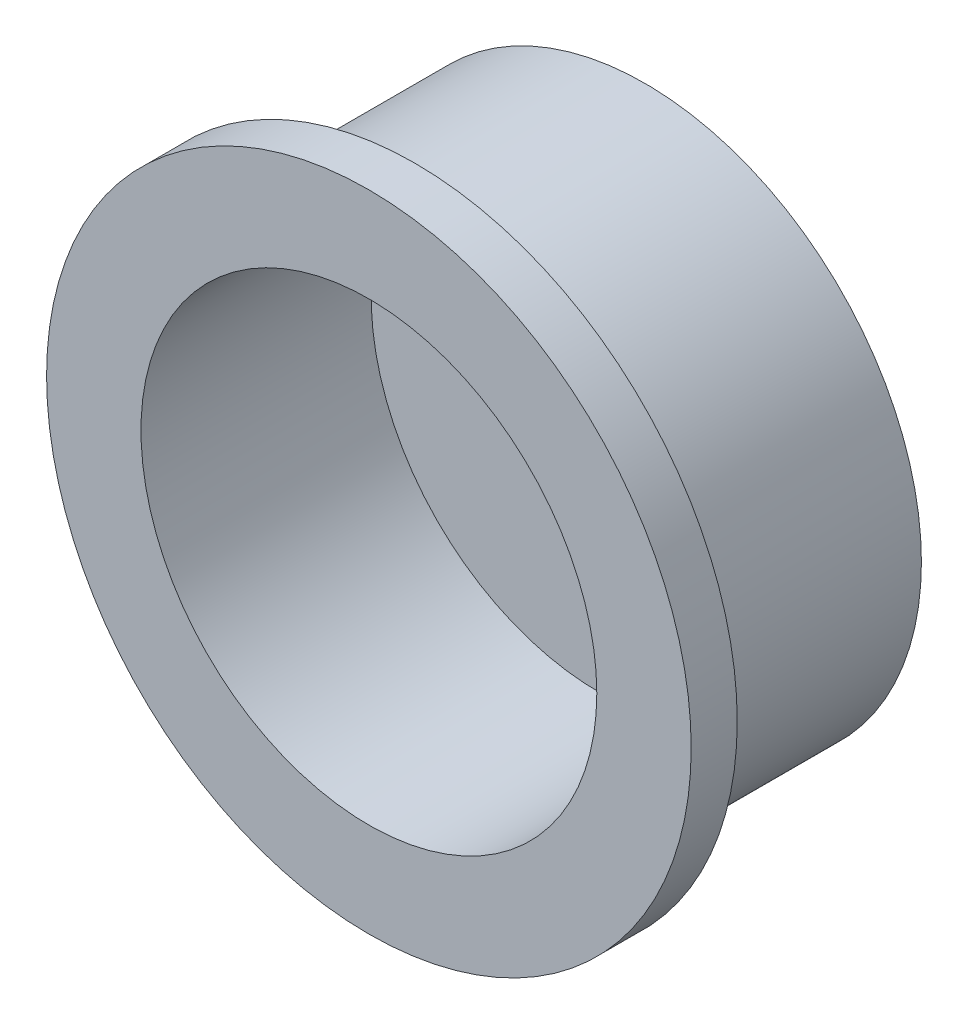
ISO-10303-21;
HEADER;
FILE_DESCRIPTION(('STEP AP214'),'2;1');
FILE_NAME('part.step','',(''),(''),'','','');
FILE_SCHEMA(('AUTOMOTIVE_DESIGN { 1 0 10303 214 1 1 1 1 }'));
ENDSEC;
DATA;
#1=APPLICATION_CONTEXT('core data for automotive mechanical design processes');
#2=APPLICATION_PROTOCOL_DEFINITION('international standard','automotive_design',2000,#1);
#3=PRODUCT_CONTEXT('',#1,'mechanical');
#4=PRODUCT('Part','Part','',(#3));
#5=PRODUCT_RELATED_PRODUCT_CATEGORY('part','',(#4));
#6=PRODUCT_DEFINITION_FORMATION('','',#4);
#7=PRODUCT_DEFINITION_CONTEXT('part definition',#1,'design');
#8=PRODUCT_DEFINITION('design','',#6,#7);
#9=PRODUCT_DEFINITION_SHAPE('','',#8);
#10=(LENGTH_UNIT() NAMED_UNIT(*) SI_UNIT(.MILLI.,.METRE.));
#11=(NAMED_UNIT(*) PLANE_ANGLE_UNIT() SI_UNIT($,.RADIAN.));
#12=(NAMED_UNIT(*) SI_UNIT($,.STERADIAN.) SOLID_ANGLE_UNIT());
#13=UNCERTAINTY_MEASURE_WITH_UNIT(LENGTH_MEASURE(1.E-05),#10,'distance_accuracy_value','');
#14=(GEOMETRIC_REPRESENTATION_CONTEXT(3) GLOBAL_UNCERTAINTY_ASSIGNED_CONTEXT((#13)) GLOBAL_UNIT_ASSIGNED_CONTEXT((#10,
#11,#12)) REPRESENTATION_CONTEXT('',''));
#15=CARTESIAN_POINT('',(0.,0.,0.));
#16=DIRECTION('',(0.,0.,1.));
#17=DIRECTION('',(1.,0.,0.));
#18=AXIS2_PLACEMENT_3D('',#15,#16,#17);
#19=CARTESIAN_POINT('',(0.,0.,1.));
#20=DIRECTION('',(0.,0.,1.));
#21=DIRECTION('',(1.,0.,0.));
#22=AXIS2_PLACEMENT_3D('',#19,#20,#21);
#23=PLANE('',#22);
#24=CARTESIAN_POINT('',(0.,0.,1.));
#25=DIRECTION('',(0.,0.,1.));
#26=DIRECTION('',(1.,0.,0.));
#27=AXIS2_PLACEMENT_3D('',#24,#25,#26);
#28=CIRCLE('',#27,1.5);
#29=CARTESIAN_POINT('',(1.5,0.,1.));
#30=VERTEX_POINT('',#29);
#31=EDGE_CURVE('E60',#30,#30,#28,.T.);
#32=ORIENTED_EDGE('',*,*,#31,.F.);
#33=EDGE_LOOP('',(#32));
#34=FACE_BOUND('',#33,.T.);
#35=CARTESIAN_POINT('',(0.,0.,1.));
#36=DIRECTION('',(0.,0.,1.));
#37=DIRECTION('',(1.,0.,0.));
#38=AXIS2_PLACEMENT_3D('',#35,#36,#37);
#39=CIRCLE('',#38,4.95);
#40=CARTESIAN_POINT('',(4.95,0.,1.));
#41=VERTEX_POINT('',#40);
#42=EDGE_CURVE('E35',#41,#41,#39,.F.);
#43=ORIENTED_EDGE('',*,*,#42,.F.);
#44=EDGE_LOOP('',(#43));
#45=FACE_BOUND('',#44,.T.);
#46=ADVANCED_FACE('F31',(#34,#45),#23,.T.);
#47=CARTESIAN_POINT('',(0.,0.,6.));
#48=DIRECTION('',(0.,0.,-1.));
#49=DIRECTION('',(-1.,0.,0.));
#50=AXIS2_PLACEMENT_3D('',#47,#48,#49);
#51=CYLINDRICAL_SURFACE('',#50,4.95);
#52=ORIENTED_EDGE('',*,*,#42,.T.);
#53=EDGE_LOOP('',(#52));
#54=FACE_BOUND('',#53,.T.);
#55=CARTESIAN_POINT('',(0.,0.,6.));
#56=DIRECTION('',(0.,0.,1.));
#57=DIRECTION('',(1.,0.,0.));
#58=AXIS2_PLACEMENT_3D('',#55,#56,#57);
#59=CIRCLE('',#58,4.95);
#60=CARTESIAN_POINT('',(4.95,0.,6.));
#61=VERTEX_POINT('',#60);
#62=EDGE_CURVE('E55',#61,#61,#59,.T.);
#63=ORIENTED_EDGE('',*,*,#62,.T.);
#64=EDGE_LOOP('',(#63));
#65=FACE_BOUND('',#64,.T.);
#66=ADVANCED_FACE('F78',(#54,#65),#51,.F.);
#67=CARTESIAN_POINT('',(0.,0.,1.));
#68=DIRECTION('',(0.,0.,-1.));
#69=DIRECTION('',(-1.,0.,0.));
#70=AXIS2_PLACEMENT_3D('',#67,#68,#69);
#71=CYLINDRICAL_SURFACE('',#70,6.);
#72=CARTESIAN_POINT('',(0.,0.,0.));
#73=DIRECTION('',(0.,0.,1.));
#74=DIRECTION('',(1.,0.,0.));
#75=AXIS2_PLACEMENT_3D('',#72,#73,#74);
#76=CIRCLE('',#75,6.);
#77=CARTESIAN_POINT('',(6.,0.,0.));
#78=VERTEX_POINT('',#77);
#79=EDGE_CURVE('E43',#78,#78,#76,.T.);
#80=ORIENTED_EDGE('',*,*,#79,.T.);
#81=EDGE_LOOP('',(#80));
#82=FACE_BOUND('',#81,.T.);
#83=CARTESIAN_POINT('',(0.,0.,5.));
#84=DIRECTION('',(0.,0.,1.));
#85=DIRECTION('',(1.,0.,0.));
#86=AXIS2_PLACEMENT_3D('',#83,#84,#85);
#87=CIRCLE('',#86,6.);
#88=CARTESIAN_POINT('',(6.,0.,5.));
#89=VERTEX_POINT('',#88);
#90=EDGE_CURVE('E10',#89,#89,#87,.T.);
#91=ORIENTED_EDGE('',*,*,#90,.F.);
#92=EDGE_LOOP('',(#91));
#93=FACE_BOUND('',#92,.T.);
#94=ADVANCED_FACE('F33',(#82,#93),#71,.T.);
#95=CARTESIAN_POINT('',(0.,0.,0.));
#96=DIRECTION('',(0.,0.,1.));
#97=DIRECTION('',(1.,0.,0.));
#98=AXIS2_PLACEMENT_3D('',#95,#96,#97);
#99=PLANE('',#98);
#100=CARTESIAN_POINT('',(0.,0.,0.));
#101=DIRECTION('',(0.,0.,1.));
#102=DIRECTION('',(1.,0.,0.));
#103=AXIS2_PLACEMENT_3D('',#100,#101,#102);
#104=CIRCLE('',#103,1.5);
#105=CARTESIAN_POINT('',(1.5,0.,0.));
#106=VERTEX_POINT('',#105);
#107=EDGE_CURVE('E59',#106,#106,#104,.T.);
#108=ORIENTED_EDGE('',*,*,#107,.T.);
#109=EDGE_LOOP('',(#108));
#110=FACE_BOUND('',#109,.T.);
#111=ORIENTED_EDGE('',*,*,#79,.F.);
#112=EDGE_LOOP('',(#111));
#113=FACE_BOUND('',#112,.T.);
#114=ADVANCED_FACE('F66',(#110,#113),#99,.F.);
#115=CARTESIAN_POINT('',(0.,0.,5.));
#116=DIRECTION('',(0.,0.,1.));
#117=DIRECTION('',(1.,0.,0.));
#118=AXIS2_PLACEMENT_3D('',#115,#116,#117);
#119=CYLINDRICAL_SURFACE('',#118,7.);
#120=CARTESIAN_POINT('',(0.,0.,5.));
#121=DIRECTION('',(0.,0.,1.));
#122=DIRECTION('',(1.,0.,0.));
#123=AXIS2_PLACEMENT_3D('',#120,#121,#122);
#124=CIRCLE('',#123,7.);
#125=CARTESIAN_POINT('',(7.,0.,5.));
#126=VERTEX_POINT('',#125);
#127=EDGE_CURVE('E48',#126,#126,#124,.T.);
#128=ORIENTED_EDGE('',*,*,#127,.T.);
#129=EDGE_LOOP('',(#128));
#130=FACE_BOUND('',#129,.T.);
#131=CARTESIAN_POINT('',(0.,0.,6.));
#132=DIRECTION('',(0.,0.,1.));
#133=DIRECTION('',(1.,0.,0.));
#134=AXIS2_PLACEMENT_3D('',#131,#132,#133);
#135=CIRCLE('',#134,7.);
#136=CARTESIAN_POINT('',(7.,0.,6.));
#137=VERTEX_POINT('',#136);
#138=EDGE_CURVE('E45',#137,#137,#135,.T.);
#139=ORIENTED_EDGE('',*,*,#138,.F.);
#140=EDGE_LOOP('',(#139));
#141=FACE_BOUND('',#140,.T.);
#142=ADVANCED_FACE('F93',(#130,#141),#119,.T.);
#143=CARTESIAN_POINT('',(0.,0.,5.));
#144=DIRECTION('',(0.,0.,1.));
#145=DIRECTION('',(1.,0.,0.));
#146=AXIS2_PLACEMENT_3D('',#143,#144,#145);
#147=PLANE('',#146);
#148=ORIENTED_EDGE('',*,*,#90,.T.);
#149=EDGE_LOOP('',(#148));
#150=FACE_BOUND('',#149,.T.);
#151=ORIENTED_EDGE('',*,*,#127,.F.);
#152=EDGE_LOOP('',(#151));
#153=FACE_BOUND('',#152,.T.);
#154=ADVANCED_FACE('F89',(#150,#153),#147,.F.);
#155=CARTESIAN_POINT('',(0.,0.,6.));
#156=DIRECTION('',(0.,0.,1.));
#157=DIRECTION('',(1.,0.,0.));
#158=AXIS2_PLACEMENT_3D('',#155,#156,#157);
#159=PLANE('',#158);
#160=ORIENTED_EDGE('',*,*,#62,.F.);
#161=EDGE_LOOP('',(#160));
#162=FACE_BOUND('',#161,.T.);
#163=ORIENTED_EDGE('',*,*,#138,.T.);
#164=EDGE_LOOP('',(#163));
#165=FACE_BOUND('',#164,.T.);
#166=ADVANCED_FACE('F72',(#162,#165),#159,.T.);
#167=CARTESIAN_POINT('',(0.,0.,0.));
#168=DIRECTION('',(0.,0.,1.));
#169=DIRECTION('',(1.,0.,0.));
#170=AXIS2_PLACEMENT_3D('',#167,#168,#169);
#171=CYLINDRICAL_SURFACE('',#170,1.5);
#172=ORIENTED_EDGE('',*,*,#107,.F.);
#173=EDGE_LOOP('',(#172));
#174=FACE_BOUND('',#173,.T.);
#175=ORIENTED_EDGE('',*,*,#31,.T.);
#176=EDGE_LOOP('',(#175));
#177=FACE_BOUND('',#176,.T.);
#178=ADVANCED_FACE('F69',(#174,#177),#171,.F.);
#179=CLOSED_SHELL('',(#46,#66,#94,#114,#142,#154,#166,#178));
#180=MANIFOLD_SOLID_BREP('B2',#179);
#181=ADVANCED_BREP_SHAPE_REPRESENTATION('',(#18,#180),#14);
#182=SHAPE_DEFINITION_REPRESENTATION(#9,#181);
ENDSEC;
END-ISO-10303-21;
